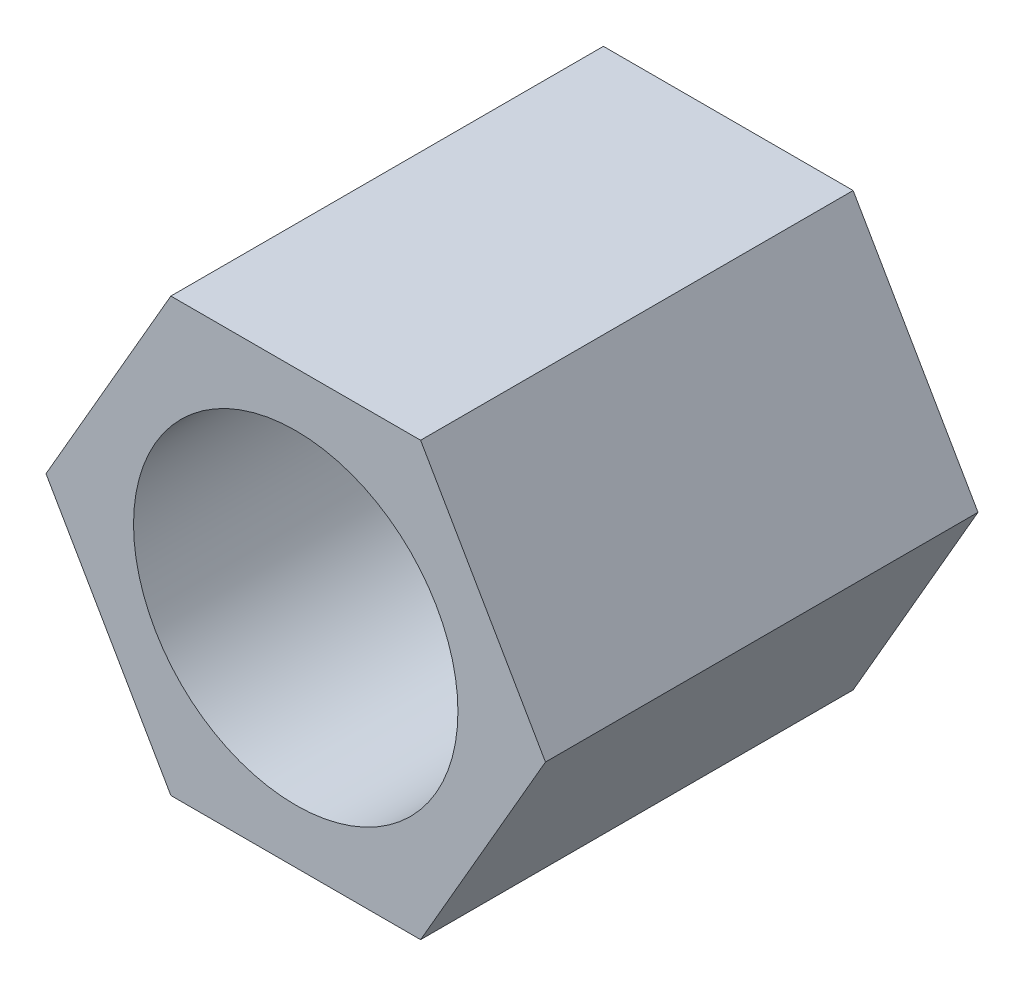
ISO-10303-21;
HEADER;
FILE_DESCRIPTION(('STEP AP214'),'2;1');
FILE_NAME('part.step','',(''),(''),'','','');
FILE_SCHEMA(('AUTOMOTIVE_DESIGN { 1 0 10303 214 1 1 1 1 }'));
ENDSEC;
DATA;
#1=APPLICATION_CONTEXT('core data for automotive mechanical design processes');
#2=APPLICATION_PROTOCOL_DEFINITION('international standard','automotive_design',2000,#1);
#3=PRODUCT_CONTEXT('',#1,'mechanical');
#4=PRODUCT('Part','Part','',(#3));
#5=PRODUCT_RELATED_PRODUCT_CATEGORY('part','',(#4));
#6=PRODUCT_DEFINITION_FORMATION('','',#4);
#7=PRODUCT_DEFINITION_CONTEXT('part definition',#1,'design');
#8=PRODUCT_DEFINITION('design','',#6,#7);
#9=PRODUCT_DEFINITION_SHAPE('','',#8);
#10=(LENGTH_UNIT() NAMED_UNIT(*) SI_UNIT(.MILLI.,.METRE.));
#11=(NAMED_UNIT(*) PLANE_ANGLE_UNIT() SI_UNIT($,.RADIAN.));
#12=(NAMED_UNIT(*) SI_UNIT($,.STERADIAN.) SOLID_ANGLE_UNIT());
#13=UNCERTAINTY_MEASURE_WITH_UNIT(LENGTH_MEASURE(1.E-05),#10,'distance_accuracy_value','');
#14=(GEOMETRIC_REPRESENTATION_CONTEXT(3) GLOBAL_UNCERTAINTY_ASSIGNED_CONTEXT((#13)) GLOBAL_UNIT_ASSIGNED_CONTEXT((#10,
#11,#12)) REPRESENTATION_CONTEXT('',''));
#15=CARTESIAN_POINT('',(0.,0.,0.));
#16=DIRECTION('',(0.,0.,1.));
#17=DIRECTION('',(1.,0.,0.));
#18=AXIS2_PLACEMENT_3D('',#15,#16,#17);
#19=CARTESIAN_POINT('',(0.,0.,0.));
#20=DIRECTION('',(0.,0.,1.));
#21=DIRECTION('',(1.,0.,0.));
#22=AXIS2_PLACEMENT_3D('',#19,#20,#21);
#23=CYLINDRICAL_SURFACE('',#22,1.5);
#24=CARTESIAN_POINT('',(0.,0.,0.));
#25=DIRECTION('',(0.,0.,1.));
#26=DIRECTION('',(1.,0.,0.));
#27=AXIS2_PLACEMENT_3D('',#24,#25,#26);
#28=CIRCLE('',#27,1.5);
#29=CARTESIAN_POINT('',(1.5,0.,0.));
#30=VERTEX_POINT('',#29);
#31=EDGE_CURVE('E131',#30,#30,#28,.T.);
#32=ORIENTED_EDGE('',*,*,#31,.F.);
#33=EDGE_LOOP('',(#32));
#34=FACE_BOUND('',#33,.T.);
#35=CARTESIAN_POINT('',(0.,0.,2.));
#36=DIRECTION('',(0.,0.,1.));
#37=DIRECTION('',(1.,0.,0.));
#38=AXIS2_PLACEMENT_3D('',#35,#36,#37);
#39=CIRCLE('',#38,1.5);
#40=CARTESIAN_POINT('',(1.5,0.,2.));
#41=VERTEX_POINT('',#40);
#42=EDGE_CURVE('E45',#41,#41,#39,.F.);
#43=ORIENTED_EDGE('',*,*,#42,.F.);
#44=EDGE_LOOP('',(#43));
#45=FACE_BOUND('',#44,.T.);
#46=ADVANCED_FACE('F41',(#34,#45),#23,.F.);
#47=CARTESIAN_POINT('',(2.30940107675851,4.,8.));
#48=DIRECTION('',(0.,-1.,0.));
#49=DIRECTION('',(1.,0.,0.));
#50=AXIS2_PLACEMENT_3D('',#47,#48,#49);
#51=PLANE('',#50);
#52=DIRECTION('',(-1.,0.,0.));
#53=VECTOR('',#52,1.);
#54=CARTESIAN_POINT('',(2.30940107675851,4.,0.));
#55=LINE('',#54,#53);
#56=CARTESIAN_POINT('',(2.30940107675851,4.,0.));
#57=VERTEX_POINT('',#56);
#58=CARTESIAN_POINT('',(-2.3094010767585,4.,0.));
#59=VERTEX_POINT('',#58);
#60=EDGE_CURVE('E127',#57,#59,#55,.T.);
#61=ORIENTED_EDGE('',*,*,#60,.T.);
#62=DIRECTION('',(0.,0.,-1.));
#63=VECTOR('',#62,1.);
#64=CARTESIAN_POINT('',(-2.3094010767585,4.,8.));
#65=LINE('',#64,#63);
#66=CARTESIAN_POINT('',(-2.3094010767585,4.,8.));
#67=VERTEX_POINT('',#66);
#68=EDGE_CURVE('E11',#67,#59,#65,.T.);
#69=ORIENTED_EDGE('',*,*,#68,.F.);
#70=DIRECTION('',(-1.,0.,0.));
#71=VECTOR('',#70,1.);
#72=CARTESIAN_POINT('',(2.30940107675851,4.,8.));
#73=LINE('',#72,#71);
#74=CARTESIAN_POINT('',(2.30940107675851,4.,8.));
#75=VERTEX_POINT('',#74);
#76=EDGE_CURVE('E138',#75,#67,#73,.T.);
#77=ORIENTED_EDGE('',*,*,#76,.F.);
#78=DIRECTION('',(0.,0.,-1.));
#79=VECTOR('',#78,1.);
#80=CARTESIAN_POINT('',(2.30940107675851,4.,8.));
#81=LINE('',#80,#79);
#82=EDGE_CURVE('E123',#75,#57,#81,.T.);
#83=ORIENTED_EDGE('',*,*,#82,.T.);
#84=EDGE_LOOP('',(#61,#69,#77,#83));
#85=FACE_BOUND('',#84,.T.);
#86=ADVANCED_FACE('F43',(#85),#51,.F.);
#87=CARTESIAN_POINT('',(-2.3094010767585,4.,8.));
#88=DIRECTION('',(0.866025403784439,-0.5,0.));
#89=DIRECTION('',(0.5,0.866025403784439,0.));
#90=AXIS2_PLACEMENT_3D('',#87,#88,#89);
#91=PLANE('',#90);
#92=DIRECTION('',(-0.5,-0.866025403784439,0.));
#93=VECTOR('',#92,1.);
#94=CARTESIAN_POINT('',(-2.3094010767585,4.,0.));
#95=LINE('',#94,#93);
#96=CARTESIAN_POINT('',(-4.61880215351701,0.,0.));
#97=VERTEX_POINT('',#96);
#98=EDGE_CURVE('E130',#59,#97,#95,.T.);
#99=ORIENTED_EDGE('',*,*,#98,.T.);
#100=DIRECTION('',(0.,0.,-1.));
#101=VECTOR('',#100,1.);
#102=CARTESIAN_POINT('',(-4.61880215351701,0.,8.));
#103=LINE('',#102,#101);
#104=CARTESIAN_POINT('',(-4.61880215351701,0.,8.));
#105=VERTEX_POINT('',#104);
#106=EDGE_CURVE('E51',#105,#97,#103,.T.);
#107=ORIENTED_EDGE('',*,*,#106,.F.);
#108=DIRECTION('',(-0.5,-0.866025403784439,0.));
#109=VECTOR('',#108,1.);
#110=CARTESIAN_POINT('',(-2.3094010767585,4.,8.));
#111=LINE('',#110,#109);
#112=EDGE_CURVE('E96',#67,#105,#111,.T.);
#113=ORIENTED_EDGE('',*,*,#112,.F.);
#114=ORIENTED_EDGE('',*,*,#68,.T.);
#115=EDGE_LOOP('',(#99,#107,#113,#114));
#116=FACE_BOUND('',#115,.T.);
#117=ADVANCED_FACE('F169',(#116),#91,.F.);
#118=CARTESIAN_POINT('',(-4.61880215351701,0.,8.));
#119=DIRECTION('',(0.866025403784439,0.5,0.));
#120=DIRECTION('',(-0.5,0.866025403784439,0.));
#121=AXIS2_PLACEMENT_3D('',#118,#119,#120);
#122=PLANE('',#121);
#123=DIRECTION('',(0.5,-0.866025403784439,0.));
#124=VECTOR('',#123,1.);
#125=CARTESIAN_POINT('',(-4.61880215351701,0.,0.));
#126=LINE('',#125,#124);
#127=CARTESIAN_POINT('',(-2.3094010767585,-4.,0.));
#128=VERTEX_POINT('',#127);
#129=EDGE_CURVE('E133',#97,#128,#126,.T.);
#130=ORIENTED_EDGE('',*,*,#129,.T.);
#131=DIRECTION('',(0.,0.,-1.));
#132=VECTOR('',#131,1.);
#133=CARTESIAN_POINT('',(-2.3094010767585,-4.,8.));
#134=LINE('',#133,#132);
#135=CARTESIAN_POINT('',(-2.3094010767585,-4.,8.));
#136=VERTEX_POINT('',#135);
#137=EDGE_CURVE('E118',#136,#128,#134,.T.);
#138=ORIENTED_EDGE('',*,*,#137,.F.);
#139=DIRECTION('',(0.5,-0.866025403784439,0.));
#140=VECTOR('',#139,1.);
#141=CARTESIAN_POINT('',(-4.61880215351701,0.,8.));
#142=LINE('',#141,#140);
#143=EDGE_CURVE('E109',#105,#136,#142,.T.);
#144=ORIENTED_EDGE('',*,*,#143,.F.);
#145=ORIENTED_EDGE('',*,*,#106,.T.);
#146=EDGE_LOOP('',(#130,#138,#144,#145));
#147=FACE_BOUND('',#146,.T.);
#148=ADVANCED_FACE('F145',(#147),#122,.F.);
#149=CARTESIAN_POINT('',(-2.3094010767585,-4.,8.));
#150=DIRECTION('',(0.,1.,0.));
#151=DIRECTION('',(-1.,0.,0.));
#152=AXIS2_PLACEMENT_3D('',#149,#150,#151);
#153=PLANE('',#152);
#154=DIRECTION('',(1.,0.,0.));
#155=VECTOR('',#154,1.);
#156=CARTESIAN_POINT('',(-2.3094010767585,-4.,0.));
#157=LINE('',#156,#155);
#158=CARTESIAN_POINT('',(2.3094010767585,-4.,0.));
#159=VERTEX_POINT('',#158);
#160=EDGE_CURVE('E117',#128,#159,#157,.T.);
#161=ORIENTED_EDGE('',*,*,#160,.T.);
#162=DIRECTION('',(0.,0.,-1.));
#163=VECTOR('',#162,1.);
#164=CARTESIAN_POINT('',(2.3094010767585,-4.,8.));
#165=LINE('',#164,#163);
#166=CARTESIAN_POINT('',(2.3094010767585,-4.,8.));
#167=VERTEX_POINT('',#166);
#168=EDGE_CURVE('E114',#167,#159,#165,.T.);
#169=ORIENTED_EDGE('',*,*,#168,.F.);
#170=DIRECTION('',(1.,0.,0.));
#171=VECTOR('',#170,1.);
#172=CARTESIAN_POINT('',(-2.3094010767585,-4.,8.));
#173=LINE('',#172,#171);
#174=EDGE_CURVE('E103',#136,#167,#173,.T.);
#175=ORIENTED_EDGE('',*,*,#174,.F.);
#176=ORIENTED_EDGE('',*,*,#137,.T.);
#177=EDGE_LOOP('',(#161,#169,#175,#176));
#178=FACE_BOUND('',#177,.T.);
#179=ADVANCED_FACE('F115',(#178),#153,.F.);
#180=CARTESIAN_POINT('',(2.3094010767585,-4.,8.));
#181=DIRECTION('',(-0.866025403784438,0.5,0.));
#182=DIRECTION('',(-0.5,-0.866025403784439,0.));
#183=AXIS2_PLACEMENT_3D('',#180,#181,#182);
#184=PLANE('',#183);
#185=DIRECTION('',(0.5,0.866025403784438,0.));
#186=VECTOR('',#185,1.);
#187=CARTESIAN_POINT('',(2.3094010767585,-4.,0.));
#188=LINE('',#187,#186);
#189=CARTESIAN_POINT('',(4.61880215351701,0.,0.));
#190=VERTEX_POINT('',#189);
#191=EDGE_CURVE('E82',#159,#190,#188,.T.);
#192=ORIENTED_EDGE('',*,*,#191,.T.);
#193=DIRECTION('',(0.,0.,-1.));
#194=VECTOR('',#193,1.);
#195=CARTESIAN_POINT('',(4.61880215351701,0.,8.));
#196=LINE('',#195,#194);
#197=CARTESIAN_POINT('',(4.61880215351701,0.,8.));
#198=VERTEX_POINT('',#197);
#199=EDGE_CURVE('E119',#198,#190,#196,.T.);
#200=ORIENTED_EDGE('',*,*,#199,.F.);
#201=DIRECTION('',(0.5,0.866025403784438,0.));
#202=VECTOR('',#201,1.);
#203=CARTESIAN_POINT('',(2.3094010767585,-4.,8.));
#204=LINE('',#203,#202);
#205=EDGE_CURVE('E107',#167,#198,#204,.T.);
#206=ORIENTED_EDGE('',*,*,#205,.F.);
#207=ORIENTED_EDGE('',*,*,#168,.T.);
#208=EDGE_LOOP('',(#192,#200,#206,#207));
#209=FACE_BOUND('',#208,.T.);
#210=ADVANCED_FACE('F121',(#209),#184,.F.);
#211=CARTESIAN_POINT('',(4.61880215351701,0.,8.));
#212=DIRECTION('',(-0.866025403784439,-0.5,0.));
#213=DIRECTION('',(0.5,-0.866025403784439,0.));
#214=AXIS2_PLACEMENT_3D('',#211,#212,#213);
#215=PLANE('',#214);
#216=DIRECTION('',(-0.5,0.866025403784439,0.));
#217=VECTOR('',#216,1.);
#218=CARTESIAN_POINT('',(4.61880215351701,0.,0.));
#219=LINE('',#218,#217);
#220=EDGE_CURVE('E88',#190,#57,#219,.T.);
#221=ORIENTED_EDGE('',*,*,#220,.T.);
#222=ORIENTED_EDGE('',*,*,#82,.F.);
#223=DIRECTION('',(-0.5,0.866025403784439,0.));
#224=VECTOR('',#223,1.);
#225=CARTESIAN_POINT('',(4.61880215351701,0.,8.));
#226=LINE('',#225,#224);
#227=EDGE_CURVE('E59',#198,#75,#226,.T.);
#228=ORIENTED_EDGE('',*,*,#227,.F.);
#229=ORIENTED_EDGE('',*,*,#199,.T.);
#230=EDGE_LOOP('',(#221,#222,#228,#229));
#231=FACE_BOUND('',#230,.T.);
#232=ADVANCED_FACE('F152',(#231),#215,.F.);
#233=CARTESIAN_POINT('',(0.,0.,8.));
#234=DIRECTION('',(0.,0.,1.));
#235=DIRECTION('',(1.,0.,0.));
#236=AXIS2_PLACEMENT_3D('',#233,#234,#235);
#237=PLANE('',#236);
#238=CARTESIAN_POINT('',(0.,0.,8.));
#239=DIRECTION('',(0.,0.,1.));
#240=DIRECTION('',(1.,0.,0.));
#241=AXIS2_PLACEMENT_3D('',#238,#239,#240);
#242=CIRCLE('',#241,3.);
#243=CARTESIAN_POINT('',(3.,0.,8.));
#244=VERTEX_POINT('',#243);
#245=EDGE_CURVE('E188',#244,#244,#242,.T.);
#246=ORIENTED_EDGE('',*,*,#245,.F.);
#247=EDGE_LOOP('',(#246));
#248=FACE_BOUND('',#247,.T.);
#249=ORIENTED_EDGE('',*,*,#76,.T.);
#250=ORIENTED_EDGE('',*,*,#112,.T.);
#251=ORIENTED_EDGE('',*,*,#143,.T.);
#252=ORIENTED_EDGE('',*,*,#174,.T.);
#253=ORIENTED_EDGE('',*,*,#205,.T.);
#254=ORIENTED_EDGE('',*,*,#227,.T.);
#255=EDGE_LOOP('',(#249,#250,#251,#252,#253,#254));
#256=FACE_BOUND('',#255,.T.);
#257=ADVANCED_FACE('F105',(#248,#256),#237,.T.);
#258=CARTESIAN_POINT('',(0.,0.,0.));
#259=DIRECTION('',(0.,0.,1.));
#260=DIRECTION('',(1.,0.,0.));
#261=AXIS2_PLACEMENT_3D('',#258,#259,#260);
#262=PLANE('',#261);
#263=ORIENTED_EDGE('',*,*,#31,.T.);
#264=EDGE_LOOP('',(#263));
#265=FACE_BOUND('',#264,.T.);
#266=ORIENTED_EDGE('',*,*,#60,.F.);
#267=ORIENTED_EDGE('',*,*,#220,.F.);
#268=ORIENTED_EDGE('',*,*,#191,.F.);
#269=ORIENTED_EDGE('',*,*,#160,.F.);
#270=ORIENTED_EDGE('',*,*,#129,.F.);
#271=ORIENTED_EDGE('',*,*,#98,.F.);
#272=EDGE_LOOP('',(#266,#267,#268,#269,#270,#271));
#273=FACE_BOUND('',#272,.T.);
#274=ADVANCED_FACE('F148',(#265,#273),#262,.F.);
#275=CARTESIAN_POINT('',(0.,0.,2.));
#276=DIRECTION('',(0.,0.,1.));
#277=DIRECTION('',(1.,0.,0.));
#278=AXIS2_PLACEMENT_3D('',#275,#276,#277);
#279=PLANE('',#278);
#280=CARTESIAN_POINT('',(0.,0.,2.));
#281=DIRECTION('',(0.,0.,1.));
#282=DIRECTION('',(1.,0.,0.));
#283=AXIS2_PLACEMENT_3D('',#280,#281,#282);
#284=CIRCLE('',#283,3.);
#285=CARTESIAN_POINT('',(3.,0.,2.));
#286=VERTEX_POINT('',#285);
#287=EDGE_CURVE('E185',#286,#286,#284,.T.);
#288=ORIENTED_EDGE('',*,*,#287,.T.);
#289=EDGE_LOOP('',(#288));
#290=FACE_BOUND('',#289,.T.);
#291=ORIENTED_EDGE('',*,*,#42,.T.);
#292=EDGE_LOOP('',(#291));
#293=FACE_BOUND('',#292,.T.);
#294=ADVANCED_FACE('F176',(#290,#293),#279,.T.);
#295=CARTESIAN_POINT('',(0.,0.,2.));
#296=DIRECTION('',(0.,0.,1.));
#297=DIRECTION('',(1.,0.,0.));
#298=AXIS2_PLACEMENT_3D('',#295,#296,#297);
#299=CYLINDRICAL_SURFACE('',#298,3.);
#300=ORIENTED_EDGE('',*,*,#287,.F.);
#301=EDGE_LOOP('',(#300));
#302=FACE_BOUND('',#301,.T.);
#303=ORIENTED_EDGE('',*,*,#245,.T.);
#304=EDGE_LOOP('',(#303));
#305=FACE_BOUND('',#304,.T.);
#306=ADVANCED_FACE('F173',(#302,#305),#299,.F.);
#307=CLOSED_SHELL('',(#46,#86,#117,#148,#179,#210,#232,#257,#274,#294,#306));
#308=MANIFOLD_SOLID_BREP('B2',#307);
#309=ADVANCED_BREP_SHAPE_REPRESENTATION('',(#18,#308),#14);
#310=SHAPE_DEFINITION_REPRESENTATION(#9,#309);
ENDSEC;
END-ISO-10303-21;
